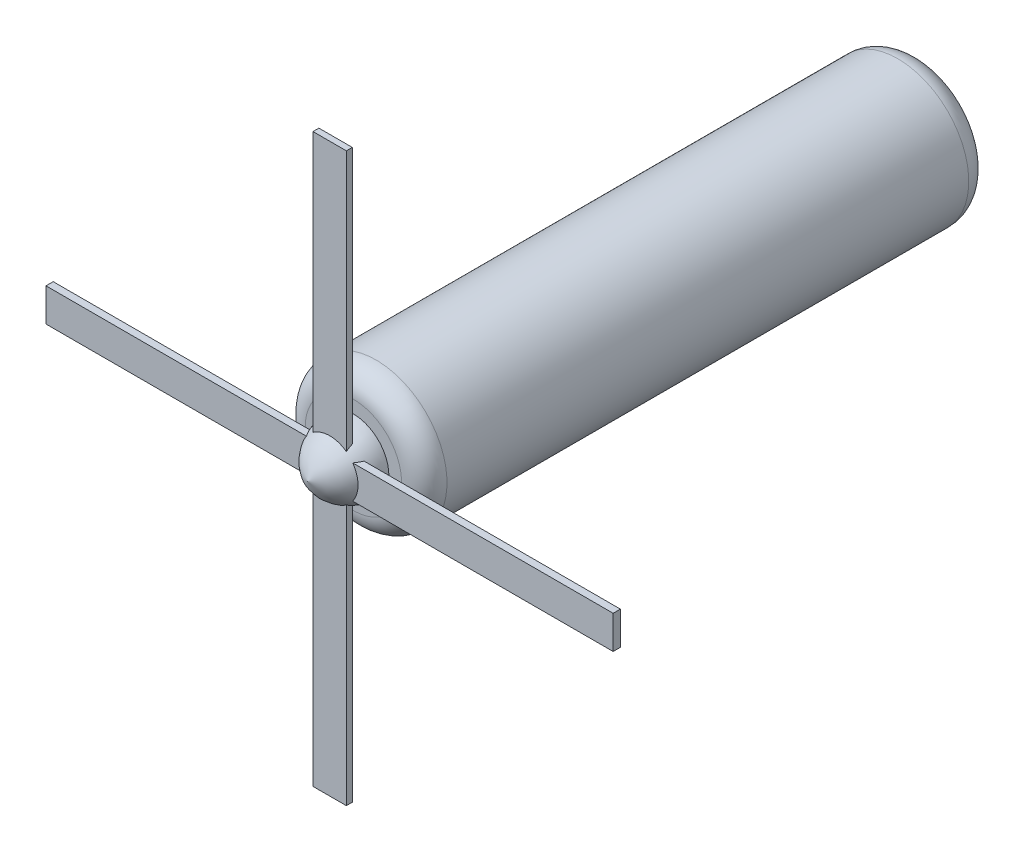
ISO-10303-21;
HEADER;
FILE_DESCRIPTION(('STEP AP214'),'2;1');
FILE_NAME('part.step','',(''),(''),'','','');
FILE_SCHEMA(('AUTOMOTIVE_DESIGN { 1 0 10303 214 1 1 1 1 }'));
ENDSEC;
DATA;
#1=APPLICATION_CONTEXT('core data for automotive mechanical design processes');
#2=APPLICATION_PROTOCOL_DEFINITION('international standard','automotive_design',2000,#1);
#3=PRODUCT_CONTEXT('',#1,'mechanical');
#4=PRODUCT('Part','Part','',(#3));
#5=PRODUCT_RELATED_PRODUCT_CATEGORY('part','',(#4));
#6=PRODUCT_DEFINITION_FORMATION('','',#4);
#7=PRODUCT_DEFINITION_CONTEXT('part definition',#1,'design');
#8=PRODUCT_DEFINITION('design','',#6,#7);
#9=PRODUCT_DEFINITION_SHAPE('','',#8);
#10=(LENGTH_UNIT() NAMED_UNIT(*) SI_UNIT(.MILLI.,.METRE.));
#11=(NAMED_UNIT(*) PLANE_ANGLE_UNIT() SI_UNIT($,.RADIAN.));
#12=(NAMED_UNIT(*) SI_UNIT($,.STERADIAN.) SOLID_ANGLE_UNIT());
#13=UNCERTAINTY_MEASURE_WITH_UNIT(LENGTH_MEASURE(1.E-05),#10,'distance_accuracy_value','');
#14=(GEOMETRIC_REPRESENTATION_CONTEXT(3) GLOBAL_UNCERTAINTY_ASSIGNED_CONTEXT((#13)) GLOBAL_UNIT_ASSIGNED_CONTEXT((#10,
#11,#12)) REPRESENTATION_CONTEXT('',''));
#15=CARTESIAN_POINT('',(0.,0.,0.));
#16=DIRECTION('',(0.,0.,1.));
#17=DIRECTION('',(1.,0.,0.));
#18=AXIS2_PLACEMENT_3D('',#15,#16,#17);
#19=CARTESIAN_POINT('',(0.,0.,0.));
#20=CARTESIAN_POINT('',(25.6502912204936,0.,-9.23171172538303));
#21=CARTESIAN_POINT('',(88.9920405419036,0.,-38.3100128710357));
#22=CARTESIAN_POINT('',(123.524419947238,0.,-115.240385969922));
#23=CARTESIAN_POINT('',(125.,0.,-161.246145611666));
#24=B_SPLINE_CURVE_WITH_KNOTS('',3,(#19,#20,#21,#22,#23),.UNSPECIFIED.,.F.,.F.,(4,1,4),(0.,
0.343948174187401,1.),.UNSPECIFIED.);
#25=CARTESIAN_POINT('',(0.,0.,0.));
#26=DIRECTION('',(0.,0.,1.));
#27=AXIS1_PLACEMENT('',#25,#26);
#28=SURFACE_OF_REVOLUTION('',#24,#27);
#29=CARTESIAN_POINT('',(0.,0.,-161.246145611666));
#30=DIRECTION('',(0.,0.,1.));
#31=DIRECTION('',(1.,0.,0.));
#32=AXIS2_PLACEMENT_3D('',#29,#30,#31);
#33=CIRCLE('',#32,125.);
#34=CARTESIAN_POINT('',(125.,0.,-161.246145611666));
#35=VERTEX_POINT('',#34);
#36=EDGE_CURVE('E222',#35,#35,#33,.T.);
#37=ORIENTED_EDGE('',*,*,#36,.T.);
#38=EDGE_LOOP('',(#37));
#39=FACE_BOUND('',#38,.T.);
#40=CARTESIAN_POINT('',(0.,0.,0.));
#41=VERTEX_POINT('',#40);
#42=VERTEX_LOOP('',#41);
#43=FACE_BOUND('',#42,.T.);
#44=CARTESIAN_POINT('',(0.,0.,-77.4921081017236));
#45=DIRECTION('',(0.,0.,1.));
#46=DIRECTION('',(1.,0.,0.));
#47=AXIS2_PLACEMENT_3D('',#44,#45,#46);
#48=CIRCLE('',#47,100.496676412725);
#49=CARTESIAN_POINT('',(58.8538375641332,81.4604675531548,-77.4921081017236));
#50=VERTEX_POINT('',#49);
#51=CARTESIAN_POINT('',(-58.8538375641332,81.4604675531549,-77.4921081017236));
#52=VERTEX_POINT('',#51);
#53=EDGE_CURVE('E378',#50,#52,#48,.T.);
#54=ORIENTED_EDGE('',*,*,#53,.T.);
#55=CARTESIAN_POINT('',(-58.8538375641332,81.4604675531549,-77.4921081017236));
#56=CARTESIAN_POINT('',(-58.8538375641332,81.8518368308111,-78.045705414009));
#57=CARTESIAN_POINT('',(-58.8538375641332,82.2394243898965,-78.6019745925555));
#58=CARTESIAN_POINT('',(-58.8538375641332,83.006708893746,-79.719222565566));
#59=CARTESIAN_POINT('',(-58.8538375641332,83.3864123579078,-80.2801968825479));
#60=CARTESIAN_POINT('',(-58.8538375641332,84.1380214047334,-81.4067939832809));
#61=CARTESIAN_POINT('',(-58.8538375641332,84.5099321099907,-81.972413349943));
#62=CARTESIAN_POINT('',(-58.8538375641332,85.2460388516834,-83.1082468306098));
#63=CARTESIAN_POINT('',(-58.8538375641332,85.6102386639113,-83.678458497797));
#64=CARTESIAN_POINT('',(-58.8538375641332,86.3309980730244,-84.8234282650685));
#65=CARTESIAN_POINT('',(-58.8538375641332,86.6875601410126,-85.3981848097219));
#66=CARTESIAN_POINT('',(-58.8538375641332,87.3931099440149,-86.5522017060144));
#67=CARTESIAN_POINT('',(-58.8538375641332,87.7420988803955,-87.1314613232096));
#68=CARTESIAN_POINT('',(-58.8538375641332,88.4325460620164,-88.294423624644));
#69=CARTESIAN_POINT('',(-58.8538375641332,88.7740045707935,-88.8781261524333));
#70=CARTESIAN_POINT('',(-58.8538375641332,89.4494583037353,-90.0499712692928));
#71=CARTESIAN_POINT('',(-58.8538375641332,89.7834521929333,-90.6381146277909));
#72=CARTESIAN_POINT('',(-58.8538375641332,90.444019902531,-91.8188179966803));
#73=CARTESIAN_POINT('',(-58.8538375641332,90.7705911407598,-92.4113794516308));
#74=CARTESIAN_POINT('',(-58.8538375641332,91.4163484340763,-93.6009001951204));
#75=CARTESIAN_POINT('',(-58.8538375641332,91.7355306758162,-94.1978615537164));
#76=CARTESIAN_POINT('',(-58.8538375641332,92.3665369278429,-95.3961675273323));
#77=CARTESIAN_POINT('',(-58.8538375641332,92.6783559032063,-95.9975147934797));
#78=CARTESIAN_POINT('',(-58.8538375641332,93.2946538001525,-97.2045831960131));
#79=CARTESIAN_POINT('',(-58.8538375641332,93.5991264676442,-97.810307525656));
#80=CARTESIAN_POINT('',(-58.8538375641332,93.8997882581418,-98.4179170134139));
#81=B_SPLINE_CURVE_WITH_KNOTS('',3,(#55,#56,#57,#58,#59,#60,#61,#62,#63,#64,#65,#66,#67,#68,#69,
#70,#71,#72,#73,#74,#75,#76,#77,#78,#79,#80),.UNSPECIFIED.,.F.,.F.,(4,2,2,2,2,2,2,2,2,2,2,2,4),
(0.,2.03388463358387,4.06601445824408,6.0967636600217,8.12649432418452,10.1555580589514,
12.1842975239531,14.2129658776479,16.241994179699,18.2717178530452,20.3024666805953,
22.3345660994062,24.3683384594325),.UNSPECIFIED.);
#82=CARTESIAN_POINT('',(-58.8538375641332,93.8997882581418,-98.4179170134139));
#83=VERTEX_POINT('',#82);
#84=EDGE_CURVE('E252',#52,#83,#81,.T.);
#85=ORIENTED_EDGE('',*,*,#84,.T.);
#86=CARTESIAN_POINT('',(0.,0.,-98.4179170134139));
#87=DIRECTION('',(0.,0.,1.));
#88=DIRECTION('',(1.,0.,0.));
#89=AXIS2_PLACEMENT_3D('',#86,#87,#88);
#90=CIRCLE('',#89,110.819422625049);
#91=CARTESIAN_POINT('',(58.8538375641332,93.8997882581418,-98.4179170134139));
#92=VERTEX_POINT('',#91);
#93=EDGE_CURVE('E372',#83,#92,#90,.F.);
#94=ORIENTED_EDGE('',*,*,#93,.T.);
#95=CARTESIAN_POINT('',(58.8538375641332,93.8997882581418,-98.417917013414));
#96=CARTESIAN_POINT('',(58.8538375641332,93.5991264676443,-97.810307525656));
#97=CARTESIAN_POINT('',(58.8538375641332,93.2946538001525,-97.2045831960131));
#98=CARTESIAN_POINT('',(58.8538375641332,92.6783559032063,-95.9975147934797));
#99=CARTESIAN_POINT('',(58.8538375641332,92.3665369278429,-95.3961675273323));
#100=CARTESIAN_POINT('',(58.8538375641332,91.7355306758162,-94.1978615537165));
#101=CARTESIAN_POINT('',(58.8538375641332,91.4163484340763,-93.6009001951204));
#102=CARTESIAN_POINT('',(58.8538375641332,90.7705911407598,-92.4113794516308));
#103=CARTESIAN_POINT('',(58.8538375641332,90.444019902531,-91.8188179966803));
#104=CARTESIAN_POINT('',(58.8538375641332,89.7834521929333,-90.6381146277909));
#105=CARTESIAN_POINT('',(58.8538375641332,89.4494583037353,-90.0499712692928));
#106=CARTESIAN_POINT('',(58.8538375641332,88.7740045707935,-88.8781261524333));
#107=CARTESIAN_POINT('',(58.8538375641332,88.4325460620164,-88.294423624644));
#108=CARTESIAN_POINT('',(58.8538375641332,87.7420988803955,-87.1314613232096));
#109=CARTESIAN_POINT('',(58.8538375641332,87.3931099440149,-86.5522017060144));
#110=CARTESIAN_POINT('',(58.8538375641332,86.6875601410126,-85.3981848097219));
#111=CARTESIAN_POINT('',(58.8538375641332,86.3309980730244,-84.8234282650685));
#112=CARTESIAN_POINT('',(58.8538375641332,85.6102386639113,-83.678458497797));
#113=CARTESIAN_POINT('',(58.8538375641332,85.2460388516834,-83.1082468306098));
#114=CARTESIAN_POINT('',(58.8538375641332,84.5099321099907,-81.972413349943));
#115=CARTESIAN_POINT('',(58.8538375641332,84.1380214047334,-81.4067939832809));
#116=CARTESIAN_POINT('',(58.8538375641332,83.3864123579078,-80.2801968825479));
#117=CARTESIAN_POINT('',(58.8538375641332,83.006708893746,-79.719222565566));
#118=CARTESIAN_POINT('',(58.8538375641332,82.2394243898964,-78.6019745925554));
#119=CARTESIAN_POINT('',(58.8538375641332,81.8518368308111,-78.0457054140089));
#120=CARTESIAN_POINT('',(58.8538375641332,81.4604675531549,-77.4921081017235));
#121=B_SPLINE_CURVE_WITH_KNOTS('',3,(#95,#96,#97,#98,#99,#100,#101,#102,#103,#104,#105,#106,
#107,#108,#109,#110,#111,#112,#113,#114,#115,#116,#117,#118,#119,#120),.UNSPECIFIED.,.F.,.F.,(4,
2,2,2,2,2,2,2,2,2,2,2,4),(0.,2.0337723600263,4.06587177883716,6.09662060638733,8.12634427973348,
10.1553725817846,12.1840409354794,14.2127804004811,16.241844135248,18.2715747994108,
20.3023240011884,22.3344538258487,24.3683384594326),.UNSPECIFIED.);
#122=EDGE_CURVE('E241',#92,#50,#121,.T.);
#123=ORIENTED_EDGE('',*,*,#122,.T.);
#124=EDGE_LOOP('',(#54,#85,#94,#123));
#125=FACE_BOUND('',#124,.T.);
#126=CARTESIAN_POINT('',(58.8538375641332,-93.8997882581418,-98.4179170134139));
#127=VERTEX_POINT('',#126);
#128=CARTESIAN_POINT('',(-58.8538375641332,-93.8997882581418,-98.4179170134139));
#129=VERTEX_POINT('',#128);
#130=EDGE_CURVE('E374',#127,#129,#90,.F.);
#131=ORIENTED_EDGE('',*,*,#130,.T.);
#132=CARTESIAN_POINT('',(-58.8538375641332,-93.8997882581418,-98.417917013414));
#133=CARTESIAN_POINT('',(-58.8538375641332,-93.5991264676443,-97.810307525656));
#134=CARTESIAN_POINT('',(-58.8538375641332,-93.2946538001525,-97.2045831960131));
#135=CARTESIAN_POINT('',(-58.8538375641332,-92.6783559032063,-95.9975147934797));
#136=CARTESIAN_POINT('',(-58.8538375641332,-92.3665369278429,-95.3961675273323));
#137=CARTESIAN_POINT('',(-58.8538375641332,-91.7355306758162,-94.1978615537165));
#138=CARTESIAN_POINT('',(-58.8538375641332,-91.4163484340763,-93.6009001951204));
#139=CARTESIAN_POINT('',(-58.8538375641332,-90.7705911407598,-92.4113794516309));
#140=CARTESIAN_POINT('',(-58.8538375641332,-90.444019902531,-91.8188179966804));
#141=CARTESIAN_POINT('',(-58.8538375641332,-89.7834521929333,-90.6381146277909));
#142=CARTESIAN_POINT('',(-58.8538375641332,-89.4494583037353,-90.0499712692928));
#143=CARTESIAN_POINT('',(-58.8538375641332,-88.7740045707935,-88.8781261524333));
#144=CARTESIAN_POINT('',(-58.8538375641332,-88.4325460620164,-88.294423624644));
#145=CARTESIAN_POINT('',(-58.8538375641332,-87.7420988803955,-87.1314613232096));
#146=CARTESIAN_POINT('',(-58.8538375641332,-87.3931099440149,-86.5522017060144));
#147=CARTESIAN_POINT('',(-58.8538375641332,-86.6875601410126,-85.3981848097219));
#148=CARTESIAN_POINT('',(-58.8538375641332,-86.3309980730244,-84.8234282650685));
#149=CARTESIAN_POINT('',(-58.8538375641332,-85.6102386639113,-83.678458497797));
#150=CARTESIAN_POINT('',(-58.8538375641332,-85.2460388516834,-83.1082468306098));
#151=CARTESIAN_POINT('',(-58.8538375641332,-84.5099321099907,-81.972413349943));
#152=CARTESIAN_POINT('',(-58.8538375641332,-84.1380214047334,-81.4067939832809));
#153=CARTESIAN_POINT('',(-58.8538375641332,-83.3864123579078,-80.2801968825479));
#154=CARTESIAN_POINT('',(-58.8538375641332,-83.006708893746,-79.719222565566));
#155=CARTESIAN_POINT('',(-58.8538375641332,-82.2394243898965,-78.6019745925555));
#156=CARTESIAN_POINT('',(-58.8538375641332,-81.8518368308111,-78.045705414009));
#157=CARTESIAN_POINT('',(-58.8538375641332,-81.4604675531549,-77.4921081017236));
#158=B_SPLINE_CURVE_WITH_KNOTS('',3,(#132,#133,#134,#135,#136,#137,#138,#139,#140,#141,#142,
#143,#144,#145,#146,#147,#148,#149,#150,#151,#152,#153,#154,#155,#156,#157),.UNSPECIFIED.,.F.,
.F.,(4,2,2,2,2,2,2,2,2,2,2,2,4),(0.,2.03377236002629,4.06587177883713,6.0966206063873,
8.12634427973344,10.1553725817846,12.1840409354793,14.2127804004811,16.241844135248,
18.2715747994108,20.3023240011884,22.3344538258486,24.3683384594325),.UNSPECIFIED.);
#159=CARTESIAN_POINT('',(-58.8538375641332,-81.4604675531549,-77.4921081017236));
#160=VERTEX_POINT('',#159);
#161=EDGE_CURVE('E267',#129,#160,#158,.T.);
#162=ORIENTED_EDGE('',*,*,#161,.T.);
#163=CARTESIAN_POINT('',(58.8538375641332,-81.4604675531549,-77.4921081017236));
#164=VERTEX_POINT('',#163);
#165=EDGE_CURVE('E383',#160,#164,#48,.T.);
#166=ORIENTED_EDGE('',*,*,#165,.T.);
#167=CARTESIAN_POINT('',(58.8538375641332,-81.4604675531549,-77.4921081017236));
#168=CARTESIAN_POINT('',(58.8538375641332,-81.8518368308111,-78.045705414009));
#169=CARTESIAN_POINT('',(58.8538375641332,-82.2394243898965,-78.6019745925555));
#170=CARTESIAN_POINT('',(58.8538375641332,-83.006708893746,-79.719222565566));
#171=CARTESIAN_POINT('',(58.8538375641332,-83.3864123579078,-80.2801968825479));
#172=CARTESIAN_POINT('',(58.8538375641332,-84.1380214047334,-81.4067939832809));
#173=CARTESIAN_POINT('',(58.8538375641332,-84.5099321099908,-81.972413349943));
#174=CARTESIAN_POINT('',(58.8538375641332,-85.2460388516834,-83.1082468306098));
#175=CARTESIAN_POINT('',(58.8538375641332,-85.6102386639113,-83.6784584977971));
#176=CARTESIAN_POINT('',(58.8538375641332,-86.3309980730244,-84.8234282650686));
#177=CARTESIAN_POINT('',(58.8538375641332,-86.6875601410126,-85.3981848097219));
#178=CARTESIAN_POINT('',(58.8538375641332,-87.3931099440149,-86.5522017060145));
#179=CARTESIAN_POINT('',(58.8538375641332,-87.7420988803955,-87.1314613232096));
#180=CARTESIAN_POINT('',(58.8538375641332,-88.4325460620165,-88.294423624644));
#181=CARTESIAN_POINT('',(58.8538375641332,-88.7740045707936,-88.8781261524334));
#182=CARTESIAN_POINT('',(58.8538375641332,-89.4494583037353,-90.0499712692929));
#183=CARTESIAN_POINT('',(58.8538375641332,-89.7834521929334,-90.638114627791));
#184=CARTESIAN_POINT('',(58.8538375641332,-90.444019902531,-91.8188179966804));
#185=CARTESIAN_POINT('',(58.8538375641332,-90.7705911407599,-92.4113794516309));
#186=CARTESIAN_POINT('',(58.8538375641332,-91.4163484340764,-93.6009001951204));
#187=CARTESIAN_POINT('',(58.8538375641332,-91.7355306758163,-94.1978615537165));
#188=CARTESIAN_POINT('',(58.8538375641332,-92.366536927843,-95.3961675273324));
#189=CARTESIAN_POINT('',(58.8538375641332,-92.6783559032064,-95.9975147934797));
#190=CARTESIAN_POINT('',(58.8538375641332,-93.2946538001525,-97.2045831960131));
#191=CARTESIAN_POINT('',(58.8538375641332,-93.5991264676443,-97.8103075256561));
#192=CARTESIAN_POINT('',(58.8538375641332,-93.8997882581418,-98.417917013414));
#193=B_SPLINE_CURVE_WITH_KNOTS('',3,(#167,#168,#169,#170,#171,#172,#173,#174,#175,#176,#177,
#178,#179,#180,#181,#182,#183,#184,#185,#186,#187,#188,#189,#190,#191,#192),.UNSPECIFIED.,.F.,
.F.,(4,2,2,2,2,2,2,2,2,2,2,2,4),(0.,2.03388463358387,4.0660144582441,6.09676366002171,
8.12649432418456,10.1555580589514,12.1842975239532,14.2129658776479,16.2419941796991,
18.2717178530452,20.3024666805954,22.3345660994062,24.3683384594325),.UNSPECIFIED.);
#194=EDGE_CURVE('E260',#164,#127,#193,.T.);
#195=ORIENTED_EDGE('',*,*,#194,.T.);
#196=EDGE_LOOP('',(#131,#162,#166,#195));
#197=FACE_BOUND('',#196,.T.);
#198=CARTESIAN_POINT('',(96.1919204966239,-58.4029933950139,-102.646254802604));
#199=CARTESIAN_POINT('',(95.6295350419684,-58.4029933950139,-101.418791584328));
#200=CARTESIAN_POINT('',(95.0519791758546,-58.4029933950139,-100.198271696093));
#201=CARTESIAN_POINT('',(93.8665471616132,-58.4029933950139,-97.771724455795));
#202=CARTESIAN_POINT('',(93.2586645659672,-58.4029933950139,-96.5657002537549));
#203=CARTESIAN_POINT('',(92.0127827145154,-58.4029933950139,-94.1691651395839));
#204=CARTESIAN_POINT('',(91.3747806983561,-58.4029933950139,-92.9786556621387));
#205=CARTESIAN_POINT('',(90.0711864321156,-58.4029933950139,-90.6185021166963));
#206=CARTESIAN_POINT('',(89.405703362363,-58.4029933950139,-89.4487977595059));
#207=CARTESIAN_POINT('',(88.0451008283854,-58.4029933950139,-87.1268921118549));
#208=CARTESIAN_POINT('',(87.3499839829918,-58.4029933950139,-85.9746892868835));
#209=CARTESIAN_POINT('',(85.930171984353,-58.4029933950139,-83.6888580667311));
#210=CARTESIAN_POINT('',(85.2054809999727,-58.4029933950139,-82.555227084961));
#211=CARTESIAN_POINT('',(83.9918265876694,-58.4029933950139,-80.7108111679923));
#212=CARTESIAN_POINT('',(83.5115922018645,-58.4029933950139,-79.9942679965446));
#213=CARTESIAN_POINT('',(82.5385404610264,-58.4029933950139,-78.5689586874799));
#214=CARTESIAN_POINT('',(82.0457135916182,-58.4029933950139,-77.8601990457563));
#215=CARTESIAN_POINT('',(81.5467662452357,-58.4029933950139,-77.1557590921573));
#216=B_SPLINE_CURVE_WITH_KNOTS('',3,(#198,#199,#200,#201,#202,#203,#204,#205,#206,#207,#208,
#209,#210,#211,#212,#213,#214,#215),.UNSPECIFIED.,.F.,.F.,(4,2,2,2,2,2,2,2,4),(0.,
4.05039931942367,8.10166346166979,12.1532996135142,16.1901502845962,20.2266449428329,
24.2625725561671,26.8502215968284,29.4398872180629),.UNSPECIFIED.);
#217=CARTESIAN_POINT('',(96.1919204966238,-58.4029933950139,-102.646254802604));
#218=VERTEX_POINT('',#217);
#219=CARTESIAN_POINT('',(81.5467662452357,-58.4029933950139,-77.1557590921573));
#220=VERTEX_POINT('',#219);
#221=EDGE_CURVE('E282',#218,#220,#216,.T.);
#222=ORIENTED_EDGE('',*,*,#221,.T.);
#223=CARTESIAN_POINT('',(0.,0.,-77.1557590921573));
#224=DIRECTION('',(0.,0.,1.));
#225=DIRECTION('',(1.,0.,0.));
#226=AXIS2_PLACEMENT_3D('',#223,#224,#225);
#227=CIRCLE('',#226,100.303463163308);
#228=CARTESIAN_POINT('',(81.5467662452357,58.4029933950139,-77.1557590921573));
#229=VERTEX_POINT('',#228);
#230=EDGE_CURVE('E49',#220,#229,#227,.T.);
#231=ORIENTED_EDGE('',*,*,#230,.T.);
#232=CARTESIAN_POINT('',(81.5467662452357,58.4029933950139,-77.1557590921573));
#233=CARTESIAN_POINT('',(82.2941359791022,58.4029933950139,-78.2109462434219));
#234=CARTESIAN_POINT('',(83.0277880570042,58.4029933950139,-79.2758291969087));
#235=CARTESIAN_POINT('',(84.4676918163973,58.4029933950139,-81.424001516216));
#236=CARTESIAN_POINT('',(85.1739428431596,58.4029933950139,-82.5072913209672));
#237=CARTESIAN_POINT('',(86.5590656968879,58.4029933950139,-84.6912763053782));
#238=CARTESIAN_POINT('',(87.2379366544571,58.4029933950139,-85.7919720361845));
#239=CARTESIAN_POINT('',(88.5660424029849,58.4029933950139,-88.0060972987876));
#240=CARTESIAN_POINT('',(89.2153686543135,58.4029933950139,-89.119471981722));
#241=CARTESIAN_POINT('',(90.4867334219318,58.4029933950139,-91.3616395238967));
#242=CARTESIAN_POINT('',(91.1087728490818,58.4029933950139,-92.4904318668288));
#243=CARTESIAN_POINT('',(92.3254622600175,58.4029933950139,-94.7625399941993));
#244=CARTESIAN_POINT('',(92.9201149822889,58.4029933950139,-95.9058543118887));
#245=CARTESIAN_POINT('',(93.9670307226149,58.4029933950139,-97.9787053717876));
#246=CARTESIAN_POINT('',(94.4241851807839,58.4029933950139,-98.9057759354708));
#247=CARTESIAN_POINT('',(95.3211798048874,58.4029933950139,-100.769282135297));
#248=CARTESIAN_POINT('',(95.7610040479469,58.4029933950139,-101.705725436224));
#249=CARTESIAN_POINT('',(96.1919204966238,58.4029933950139,-102.646254802604));
#250=B_SPLINE_CURVE_WITH_KNOTS('',3,(#232,#233,#234,#235,#236,#237,#238,#239,#240,#241,#242,
#243,#244,#245,#246,#247,#248,#249),.UNSPECIFIED.,.F.,.F.,(4,2,2,2,2,2,2,2,4),(0.,
3.87902045212345,7.75813353372586,11.6373696916473,15.503641660822,19.3697844717884,
23.2355398514702,26.3363346255269,29.4399149373714),.UNSPECIFIED.);
#251=CARTESIAN_POINT('',(96.1919204966238,58.4029933950139,-102.646254802604));
#252=VERTEX_POINT('',#251);
#253=EDGE_CURVE('E274',#229,#252,#250,.T.);
#254=ORIENTED_EDGE('',*,*,#253,.T.);
#255=CARTESIAN_POINT('',(0.,0.,-102.646254802604));
#256=DIRECTION('',(0.,0.,1.));
#257=DIRECTION('',(1.,0.,0.));
#258=AXIS2_PLACEMENT_3D('',#255,#256,#257);
#259=CIRCLE('',#258,112.533529253849);
#260=EDGE_CURVE('E388',#252,#218,#259,.F.);
#261=ORIENTED_EDGE('',*,*,#260,.T.);
#262=EDGE_LOOP('',(#222,#231,#254,#261));
#263=FACE_BOUND('',#262,.T.);
#264=CARTESIAN_POINT('',(-96.1919204966239,58.4029933950139,-102.646254802604));
#265=CARTESIAN_POINT('',(-95.6295350419684,58.4029933950139,-101.418791584328));
#266=CARTESIAN_POINT('',(-95.0519791758546,58.4029933950139,-100.198271696093));
#267=CARTESIAN_POINT('',(-93.8665471616132,58.4029933950139,-97.771724455795));
#268=CARTESIAN_POINT('',(-93.2586645659672,58.4029933950139,-96.5657002537549));
#269=CARTESIAN_POINT('',(-92.0127827145154,58.4029933950139,-94.169165139584));
#270=CARTESIAN_POINT('',(-91.3747806983561,58.4029933950139,-92.9786556621388));
#271=CARTESIAN_POINT('',(-90.0711864321156,58.4029933950139,-90.6185021166963));
#272=CARTESIAN_POINT('',(-89.405703362363,58.4029933950139,-89.4487977595059));
#273=CARTESIAN_POINT('',(-88.0451008283854,58.4029933950139,-87.126892111855));
#274=CARTESIAN_POINT('',(-87.3499839829917,58.4029933950139,-85.9746892868835));
#275=CARTESIAN_POINT('',(-85.9301719843531,58.4029933950139,-83.6888580667311));
#276=CARTESIAN_POINT('',(-85.2054809999728,58.4029933950139,-82.5552270849609));
#277=CARTESIAN_POINT('',(-83.9918265876695,58.4029933950139,-80.7108111679923));
#278=CARTESIAN_POINT('',(-83.5115922018646,58.4029933950139,-79.9942679965447));
#279=CARTESIAN_POINT('',(-82.5385404610264,58.4029933950139,-78.56895868748));
#280=CARTESIAN_POINT('',(-82.0457135916183,58.4029933950139,-77.8601990457564));
#281=CARTESIAN_POINT('',(-81.5467662452358,58.4029933950139,-77.1557590921574));
#282=B_SPLINE_CURVE_WITH_KNOTS('',3,(#264,#265,#266,#267,#268,#269,#270,#271,#272,#273,#274,
#275,#276,#277,#278,#279,#280,#281),.UNSPECIFIED.,.F.,.F.,(4,2,2,2,2,2,2,2,4),(0.,
4.05039931942367,8.10166346166977,12.1532996135141,16.1901502845963,20.2266449428329,
24.2625725561671,26.8502215968283,29.4398872180628),.UNSPECIFIED.);
#283=CARTESIAN_POINT('',(-96.191920496624,58.4029933950139,-102.646254802604));
#284=VERTEX_POINT('',#283);
#285=CARTESIAN_POINT('',(-81.5467662452358,58.4029933950138,-77.1557590921574));
#286=VERTEX_POINT('',#285);
#287=EDGE_CURVE('E287',#284,#286,#282,.T.);
#288=ORIENTED_EDGE('',*,*,#287,.T.);
#289=CARTESIAN_POINT('',(-81.5467662452358,-58.4029933950139,-77.1557590921573));
#290=VERTEX_POINT('',#289);
#291=EDGE_CURVE('E11',#286,#290,#227,.T.);
#292=ORIENTED_EDGE('',*,*,#291,.T.);
#293=CARTESIAN_POINT('',(-81.5467662452358,-58.4029933950138,-77.1557590921573));
#294=CARTESIAN_POINT('',(-82.2941359791023,-58.4029933950139,-78.2109462434219));
#295=CARTESIAN_POINT('',(-83.0277880570042,-58.4029933950139,-79.2758291969087));
#296=CARTESIAN_POINT('',(-84.4676918163974,-58.4029933950139,-81.4240015162161));
#297=CARTESIAN_POINT('',(-85.1739428431596,-58.4029933950139,-82.5072913209672));
#298=CARTESIAN_POINT('',(-86.5590656968879,-58.4029933950139,-84.6912763053782));
#299=CARTESIAN_POINT('',(-87.2379366544571,-58.4029933950139,-85.7919720361845));
#300=CARTESIAN_POINT('',(-88.5660424029849,-58.4029933950139,-88.0060972987876));
#301=CARTESIAN_POINT('',(-89.2153686543135,-58.4029933950139,-89.119471981722));
#302=CARTESIAN_POINT('',(-90.4867334219318,-58.4029933950139,-91.3616395238968));
#303=CARTESIAN_POINT('',(-91.1087728490818,-58.4029933950139,-92.4904318668288));
#304=CARTESIAN_POINT('',(-92.3254622600175,-58.4029933950139,-94.7625399941993));
#305=CARTESIAN_POINT('',(-92.9201149822888,-58.4029933950139,-95.9058543118888));
#306=CARTESIAN_POINT('',(-93.9670307226149,-58.4029933950139,-97.9787053717877));
#307=CARTESIAN_POINT('',(-94.424185180784,-58.4029933950139,-98.9057759354708));
#308=CARTESIAN_POINT('',(-95.3211798048875,-58.4029933950139,-100.769282135297));
#309=CARTESIAN_POINT('',(-95.7610040479469,-58.4029933950139,-101.705725436224));
#310=CARTESIAN_POINT('',(-96.1919204966239,-58.4029933950139,-102.646254802605));
#311=B_SPLINE_CURVE_WITH_KNOTS('',3,(#293,#294,#295,#296,#297,#298,#299,#300,#301,#302,#303,
#304,#305,#306,#307,#308,#309,#310),.UNSPECIFIED.,.F.,.F.,(4,2,2,2,2,2,2,2,4),(0.,
3.87902045212344,7.75813353372581,11.6373696916473,15.503641660822,19.3697844717884,
23.2355398514702,26.3363346255269,29.4399149373714),.UNSPECIFIED.);
#312=CARTESIAN_POINT('',(-96.1919204966238,-58.4029933950139,-102.646254802604));
#313=VERTEX_POINT('',#312);
#314=EDGE_CURVE('E37',#290,#313,#311,.T.);
#315=ORIENTED_EDGE('',*,*,#314,.T.);
#316=EDGE_CURVE('E293',#313,#284,#259,.F.);
#317=ORIENTED_EDGE('',*,*,#316,.T.);
#318=EDGE_LOOP('',(#288,#292,#315,#317));
#319=FACE_BOUND('',#318,.T.);
#320=ADVANCED_FACE('F33',(#39,#43,#125,#197,#263,#319),#28,.F.);
#321=CARTESIAN_POINT('',(0.,0.,-2161.24614561167));
#322=DIRECTION('',(0.,0.,1.));
#323=DIRECTION('',(1.,0.,0.));
#324=AXIS2_PLACEMENT_3D('',#321,#322,#323);
#325=CYLINDRICAL_SURFACE('',#324,250.);
#326=CARTESIAN_POINT('',(0.,0.,-241.246145611666));
#327=DIRECTION('',(0.,0.,-1.));
#328=DIRECTION('',(-1.,0.,0.));
#329=AXIS2_PLACEMENT_3D('',#326,#327,#328);
#330=CIRCLE('',#329,250.);
#331=CARTESIAN_POINT('',(-250.,0.,-241.246145611666));
#332=VERTEX_POINT('',#331);
#333=EDGE_CURVE('E363',#332,#332,#330,.T.);
#334=ORIENTED_EDGE('',*,*,#333,.T.);
#335=EDGE_LOOP('',(#334));
#336=FACE_BOUND('',#335,.T.);
#337=CARTESIAN_POINT('',(0.,0.,-2081.24614561167));
#338=DIRECTION('',(0.,0.,-1.));
#339=DIRECTION('',(-1.,0.,0.));
#340=AXIS2_PLACEMENT_3D('',#337,#338,#339);
#341=CIRCLE('',#340,250.);
#342=CARTESIAN_POINT('',(-250.,0.,-2081.24614561167));
#343=VERTEX_POINT('',#342);
#344=EDGE_CURVE('E361',#343,#343,#341,.F.);
#345=ORIENTED_EDGE('',*,*,#344,.T.);
#346=EDGE_LOOP('',(#345));
#347=FACE_BOUND('',#346,.T.);
#348=ADVANCED_FACE('F234',(#336,#347),#325,.T.);
#349=CARTESIAN_POINT('',(0.,0.,-2161.24614561167));
#350=DIRECTION('',(0.,0.,-1.));
#351=DIRECTION('',(-1.,0.,0.));
#352=AXIS2_PLACEMENT_3D('',#349,#350,#351);
#353=PLANE('',#352);
#354=CARTESIAN_POINT('',(0.,0.,-2161.24614561167));
#355=DIRECTION('',(0.,0.,-1.));
#356=DIRECTION('',(-1.,0.,0.));
#357=AXIS2_PLACEMENT_3D('',#354,#355,#356);
#358=CIRCLE('',#357,170.);
#359=CARTESIAN_POINT('',(-170.,0.,-2161.24614561167));
#360=VERTEX_POINT('',#359);
#361=EDGE_CURVE('E370',#360,#360,#358,.T.);
#362=ORIENTED_EDGE('',*,*,#361,.T.);
#363=EDGE_LOOP('',(#362));
#364=FACE_BOUND('',#363,.T.);
#365=ADVANCED_FACE('F344',(#364),#353,.T.);
#366=CARTESIAN_POINT('',(0.,0.,-161.246145611666));
#367=DIRECTION('',(0.,0.,-1.));
#368=DIRECTION('',(-1.,0.,0.));
#369=AXIS2_PLACEMENT_3D('',#366,#367,#368);
#370=PLANE('',#369);
#371=CARTESIAN_POINT('',(0.,0.,-161.246145611666));
#372=DIRECTION('',(0.,0.,-1.));
#373=DIRECTION('',(-1.,0.,0.));
#374=AXIS2_PLACEMENT_3D('',#371,#372,#373);
#375=CIRCLE('',#374,170.);
#376=CARTESIAN_POINT('',(-170.,0.,-161.246145611666));
#377=VERTEX_POINT('',#376);
#378=EDGE_CURVE('E358',#377,#377,#375,.F.);
#379=ORIENTED_EDGE('',*,*,#378,.T.);
#380=EDGE_LOOP('',(#379));
#381=FACE_BOUND('',#380,.T.);
#382=ORIENTED_EDGE('',*,*,#36,.F.);
#383=EDGE_LOOP('',(#382));
#384=FACE_BOUND('',#383,.T.);
#385=ADVANCED_FACE('F347',(#381,#384),#370,.F.);
#386=CARTESIAN_POINT('',(0.,0.,-241.246145611666));
#387=DIRECTION('',(0.,0.,-1.));
#388=DIRECTION('',(-1.,0.,0.));
#389=AXIS2_PLACEMENT_3D('',#386,#387,#388);
#390=TOROIDAL_SURFACE('',#389,170.,80.);
#391=ORIENTED_EDGE('',*,*,#378,.F.);
#392=EDGE_LOOP('',(#391));
#393=FACE_BOUND('',#392,.T.);
#394=ORIENTED_EDGE('',*,*,#333,.F.);
#395=EDGE_LOOP('',(#394));
#396=FACE_BOUND('',#395,.T.);
#397=ADVANCED_FACE('F237',(#393,#396),#390,.T.);
#398=CARTESIAN_POINT('',(0.,0.,-2081.24614561167));
#399=DIRECTION('',(0.,0.,-1.));
#400=DIRECTION('',(-1.,0.,0.));
#401=AXIS2_PLACEMENT_3D('',#398,#399,#400);
#402=TOROIDAL_SURFACE('',#401,170.,80.);
#403=ORIENTED_EDGE('',*,*,#344,.F.);
#404=EDGE_LOOP('',(#403));
#405=FACE_BOUND('',#404,.T.);
#406=ORIENTED_EDGE('',*,*,#361,.F.);
#407=EDGE_LOOP('',(#406));
#408=FACE_BOUND('',#407,.T.);
#409=ADVANCED_FACE('F35',(#405,#408),#402,.T.);
#410=CARTESIAN_POINT('',(0.,1000.,0.));
#411=DIRECTION('',(0.,1.,0.));
#412=DIRECTION('',(0.,0.,1.));
#413=AXIS2_PLACEMENT_3D('',#410,#411,#412);
#414=PLANE('',#413);
#415=DIRECTION('',(0.,0.,1.));
#416=VECTOR('',#415,1.);
#417=CARTESIAN_POINT('',(-58.8538375641332,1000.,-77.4921081017236));
#418=LINE('',#417,#416);
#419=CARTESIAN_POINT('',(-58.8538375641332,1000.,-98.417917013414));
#420=VERTEX_POINT('',#419);
#421=CARTESIAN_POINT('',(-58.8538375641332,1000.,-77.4921081017236));
#422=VERTEX_POINT('',#421);
#423=EDGE_CURVE('E190',#420,#422,#418,.T.);
#424=ORIENTED_EDGE('',*,*,#423,.T.);
#425=DIRECTION('',(1.,0.,0.));
#426=VECTOR('',#425,1.);
#427=CARTESIAN_POINT('',(58.8538375641332,1000.,-77.4921081017236));
#428=LINE('',#427,#426);
#429=CARTESIAN_POINT('',(58.8538375641332,1000.,-77.4921081017236));
#430=VERTEX_POINT('',#429);
#431=EDGE_CURVE('E193',#422,#430,#428,.T.);
#432=ORIENTED_EDGE('',*,*,#431,.T.);
#433=DIRECTION('',(0.,0.,-1.));
#434=VECTOR('',#433,1.);
#435=CARTESIAN_POINT('',(58.8538375641332,1000.,-77.4921081017236));
#436=LINE('',#435,#434);
#437=CARTESIAN_POINT('',(58.8538375641332,1000.,-98.417917013414));
#438=VERTEX_POINT('',#437);
#439=EDGE_CURVE('E196',#430,#438,#436,.T.);
#440=ORIENTED_EDGE('',*,*,#439,.T.);
#441=DIRECTION('',(-1.,0.,0.));
#442=VECTOR('',#441,1.);
#443=CARTESIAN_POINT('',(58.8538375641332,1000.,-98.417917013414));
#444=LINE('',#443,#442);
#445=EDGE_CURVE('E198',#438,#420,#444,.T.);
#446=ORIENTED_EDGE('',*,*,#445,.T.);
#447=EDGE_LOOP('',(#424,#432,#440,#446));
#448=FACE_BOUND('',#447,.T.);
#449=ADVANCED_FACE('F315',(#448),#414,.T.);
#450=CARTESIAN_POINT('',(58.8538375641332,1000.,-98.417917013414));
#451=DIRECTION('',(0.,0.,1.));
#452=DIRECTION('',(1.,0.,0.));
#453=AXIS2_PLACEMENT_3D('',#450,#451,#452);
#454=PLANE('',#453);
#455=ORIENTED_EDGE('',*,*,#93,.F.);
#456=DIRECTION('',(0.,-1.,0.));
#457=VECTOR('',#456,1.);
#458=CARTESIAN_POINT('',(-58.8538375641332,1000.,-98.417917013414));
#459=LINE('',#458,#457);
#460=EDGE_CURVE('E208',#420,#83,#459,.T.);
#461=ORIENTED_EDGE('',*,*,#460,.F.);
#462=ORIENTED_EDGE('',*,*,#445,.F.);
#463=DIRECTION('',(0.,-1.,0.));
#464=VECTOR('',#463,1.);
#465=CARTESIAN_POINT('',(58.8538375641332,1000.,-98.417917013414));
#466=LINE('',#465,#464);
#467=EDGE_CURVE('E212',#438,#92,#466,.T.);
#468=ORIENTED_EDGE('',*,*,#467,.T.);
#469=EDGE_LOOP('',(#455,#461,#462,#468));
#470=FACE_BOUND('',#469,.T.);
#471=ADVANCED_FACE('F318',(#470),#454,.F.);
#472=CARTESIAN_POINT('',(58.8538375641332,1000.,-77.4921081017236));
#473=DIRECTION('',(-1.,0.,0.));
#474=DIRECTION('',(0.,0.,1.));
#475=AXIS2_PLACEMENT_3D('',#472,#473,#474);
#476=PLANE('',#475);
#477=ORIENTED_EDGE('',*,*,#122,.F.);
#478=ORIENTED_EDGE('',*,*,#467,.F.);
#479=ORIENTED_EDGE('',*,*,#439,.F.);
#480=DIRECTION('',(0.,-1.,0.));
#481=VECTOR('',#480,1.);
#482=CARTESIAN_POINT('',(58.8538375641332,1000.,-77.4921081017236));
#483=LINE('',#482,#481);
#484=EDGE_CURVE('E215',#430,#50,#483,.T.);
#485=ORIENTED_EDGE('',*,*,#484,.T.);
#486=EDGE_LOOP('',(#477,#478,#479,#485));
#487=FACE_BOUND('',#486,.T.);
#488=ADVANCED_FACE('F326',(#487),#476,.F.);
#489=CARTESIAN_POINT('',(58.8538375641332,1000.,-77.4921081017236));
#490=DIRECTION('',(0.,0.,-1.));
#491=DIRECTION('',(-1.,0.,0.));
#492=AXIS2_PLACEMENT_3D('',#489,#490,#491);
#493=PLANE('',#492);
#494=ORIENTED_EDGE('',*,*,#53,.F.);
#495=ORIENTED_EDGE('',*,*,#484,.F.);
#496=ORIENTED_EDGE('',*,*,#431,.F.);
#497=DIRECTION('',(0.,-1.,0.));
#498=VECTOR('',#497,1.);
#499=CARTESIAN_POINT('',(-58.8538375641332,1000.,-77.4921081017236));
#500=LINE('',#499,#498);
#501=EDGE_CURVE('E219',#422,#52,#500,.T.);
#502=ORIENTED_EDGE('',*,*,#501,.T.);
#503=EDGE_LOOP('',(#494,#495,#496,#502));
#504=FACE_BOUND('',#503,.T.);
#505=ADVANCED_FACE('F332',(#504),#493,.F.);
#506=CARTESIAN_POINT('',(-58.8538375641332,1000.,-77.4921081017236));
#507=DIRECTION('',(1.,0.,0.));
#508=DIRECTION('',(0.,0.,-1.));
#509=AXIS2_PLACEMENT_3D('',#506,#507,#508);
#510=PLANE('',#509);
#511=ORIENTED_EDGE('',*,*,#84,.F.);
#512=ORIENTED_EDGE('',*,*,#501,.F.);
#513=ORIENTED_EDGE('',*,*,#423,.F.);
#514=ORIENTED_EDGE('',*,*,#460,.T.);
#515=EDGE_LOOP('',(#511,#512,#513,#514));
#516=FACE_BOUND('',#515,.T.);
#517=ADVANCED_FACE('F338',(#516),#510,.F.);
#518=ORIENTED_EDGE('',*,*,#161,.F.);
#519=CARTESIAN_POINT('',(-58.8538375641332,-1000.,-98.417917013414));
#520=VERTEX_POINT('',#519);
#521=EDGE_CURVE('E199',#129,#520,#459,.T.);
#522=ORIENTED_EDGE('',*,*,#521,.T.);
#523=DIRECTION('',(0.,0.,1.));
#524=VECTOR('',#523,1.);
#525=CARTESIAN_POINT('',(-58.8538375641332,-1000.,-77.4921081017236));
#526=LINE('',#525,#524);
#527=CARTESIAN_POINT('',(-58.8538375641332,-1000.,-77.4921081017236));
#528=VERTEX_POINT('',#527);
#529=EDGE_CURVE('E181',#520,#528,#526,.T.);
#530=ORIENTED_EDGE('',*,*,#529,.T.);
#531=EDGE_CURVE('E218',#160,#528,#500,.T.);
#532=ORIENTED_EDGE('',*,*,#531,.F.);
#533=EDGE_LOOP('',(#518,#522,#530,#532));
#534=FACE_BOUND('',#533,.T.);
#535=ADVANCED_FACE('F342',(#534),#510,.F.);
#536=ORIENTED_EDGE('',*,*,#194,.F.);
#537=CARTESIAN_POINT('',(58.8538375641332,-1000.,-77.4921081017236));
#538=VERTEX_POINT('',#537);
#539=EDGE_CURVE('E214',#164,#538,#483,.T.);
#540=ORIENTED_EDGE('',*,*,#539,.T.);
#541=DIRECTION('',(0.,0.,-1.));
#542=VECTOR('',#541,1.);
#543=CARTESIAN_POINT('',(58.8538375641332,-1000.,-77.4921081017236));
#544=LINE('',#543,#542);
#545=CARTESIAN_POINT('',(58.8538375641332,-1000.,-98.417917013414));
#546=VERTEX_POINT('',#545);
#547=EDGE_CURVE('E203',#538,#546,#544,.T.);
#548=ORIENTED_EDGE('',*,*,#547,.T.);
#549=EDGE_CURVE('E211',#127,#546,#466,.T.);
#550=ORIENTED_EDGE('',*,*,#549,.F.);
#551=EDGE_LOOP('',(#536,#540,#548,#550));
#552=FACE_BOUND('',#551,.T.);
#553=ADVANCED_FACE('F334',(#552),#476,.F.);
#554=ORIENTED_EDGE('',*,*,#130,.F.);
#555=ORIENTED_EDGE('',*,*,#549,.T.);
#556=DIRECTION('',(-1.,0.,0.));
#557=VECTOR('',#556,1.);
#558=CARTESIAN_POINT('',(58.8538375641332,-1000.,-98.417917013414));
#559=LINE('',#558,#557);
#560=EDGE_CURVE('E194',#546,#520,#559,.T.);
#561=ORIENTED_EDGE('',*,*,#560,.T.);
#562=ORIENTED_EDGE('',*,*,#521,.F.);
#563=EDGE_LOOP('',(#554,#555,#561,#562));
#564=FACE_BOUND('',#563,.T.);
#565=ADVANCED_FACE('F328',(#564),#454,.F.);
#566=ORIENTED_EDGE('',*,*,#165,.F.);
#567=ORIENTED_EDGE('',*,*,#531,.T.);
#568=DIRECTION('',(1.,0.,0.));
#569=VECTOR('',#568,1.);
#570=CARTESIAN_POINT('',(58.8538375641332,-1000.,-77.4921081017236));
#571=LINE('',#570,#569);
#572=EDGE_CURVE('E185',#528,#538,#571,.T.);
#573=ORIENTED_EDGE('',*,*,#572,.T.);
#574=ORIENTED_EDGE('',*,*,#539,.F.);
#575=EDGE_LOOP('',(#566,#567,#573,#574));
#576=FACE_BOUND('',#575,.T.);
#577=ADVANCED_FACE('F323',(#576),#493,.F.);
#578=CARTESIAN_POINT('',(0.,-1000.,0.));
#579=DIRECTION('',(0.,1.,0.));
#580=DIRECTION('',(0.,0.,1.));
#581=AXIS2_PLACEMENT_3D('',#578,#579,#580);
#582=PLANE('',#581);
#583=ORIENTED_EDGE('',*,*,#529,.F.);
#584=ORIENTED_EDGE('',*,*,#560,.F.);
#585=ORIENTED_EDGE('',*,*,#547,.F.);
#586=ORIENTED_EDGE('',*,*,#572,.F.);
#587=EDGE_LOOP('',(#583,#584,#585,#586));
#588=FACE_BOUND('',#587,.T.);
#589=ADVANCED_FACE('F320',(#588),#582,.F.);
#590=CARTESIAN_POINT('',(1000.,0.,0.));
#591=DIRECTION('',(1.,0.,0.));
#592=DIRECTION('',(0.,0.,-1.));
#593=AXIS2_PLACEMENT_3D('',#590,#591,#592);
#594=PLANE('',#593);
#595=DIRECTION('',(0.,-1.,0.));
#596=VECTOR('',#595,1.);
#597=CARTESIAN_POINT('',(1000.,-58.4029933950139,-77.1557590921573));
#598=LINE('',#597,#596);
#599=CARTESIAN_POINT('',(1000.,58.4029933950139,-77.1557590921573));
#600=VERTEX_POINT('',#599);
#601=CARTESIAN_POINT('',(1000.,-58.4029933950139,-77.1557590921573));
#602=VERTEX_POINT('',#601);
#603=EDGE_CURVE('E169',#600,#602,#598,.T.);
#604=ORIENTED_EDGE('',*,*,#603,.T.);
#605=DIRECTION('',(0.,0.,-1.));
#606=VECTOR('',#605,1.);
#607=CARTESIAN_POINT('',(1000.,-58.4029933950139,-102.646254802604));
#608=LINE('',#607,#606);
#609=CARTESIAN_POINT('',(1000.,-58.4029933950139,-102.646254802604));
#610=VERTEX_POINT('',#609);
#611=EDGE_CURVE('E158',#602,#610,#608,.T.);
#612=ORIENTED_EDGE('',*,*,#611,.T.);
#613=DIRECTION('',(0.,1.,0.));
#614=VECTOR('',#613,1.);
#615=CARTESIAN_POINT('',(1000.,-58.4029933950139,-102.646254802604));
#616=LINE('',#615,#614);
#617=CARTESIAN_POINT('',(1000.,58.4029933950139,-102.646254802604));
#618=VERTEX_POINT('',#617);
#619=EDGE_CURVE('E168',#610,#618,#616,.T.);
#620=ORIENTED_EDGE('',*,*,#619,.T.);
#621=DIRECTION('',(0.,0.,1.));
#622=VECTOR('',#621,1.);
#623=CARTESIAN_POINT('',(1000.,58.4029933950139,-102.646254802604));
#624=LINE('',#623,#622);
#625=EDGE_CURVE('E173',#618,#600,#624,.T.);
#626=ORIENTED_EDGE('',*,*,#625,.T.);
#627=EDGE_LOOP('',(#604,#612,#620,#626));
#628=FACE_BOUND('',#627,.T.);
#629=ADVANCED_FACE('F172',(#628),#594,.T.);
#630=CARTESIAN_POINT('',(1000.,58.4029933950139,-102.646254802604));
#631=DIRECTION('',(0.,-1.,0.));
#632=DIRECTION('',(0.,0.,-1.));
#633=AXIS2_PLACEMENT_3D('',#630,#631,#632);
#634=PLANE('',#633);
#635=ORIENTED_EDGE('',*,*,#253,.F.);
#636=DIRECTION('',(-1.,0.,0.));
#637=VECTOR('',#636,1.);
#638=CARTESIAN_POINT('',(1000.,58.4029933950139,-77.1557590921573));
#639=LINE('',#638,#637);
#640=EDGE_CURVE('E416',#600,#229,#639,.T.);
#641=ORIENTED_EDGE('',*,*,#640,.F.);
#642=ORIENTED_EDGE('',*,*,#625,.F.);
#643=DIRECTION('',(-1.,0.,0.));
#644=VECTOR('',#643,1.);
#645=CARTESIAN_POINT('',(1000.,58.4029933950139,-102.646254802604));
#646=LINE('',#645,#644);
#647=EDGE_CURVE('E64',#618,#252,#646,.T.);
#648=ORIENTED_EDGE('',*,*,#647,.T.);
#649=EDGE_LOOP('',(#635,#641,#642,#648));
#650=FACE_BOUND('',#649,.T.);
#651=ADVANCED_FACE('F294',(#650),#634,.F.);
#652=CARTESIAN_POINT('',(1000.,-58.4029933950139,-102.646254802604));
#653=DIRECTION('',(0.,0.,1.));
#654=DIRECTION('',(1.,0.,0.));
#655=AXIS2_PLACEMENT_3D('',#652,#653,#654);
#656=PLANE('',#655);
#657=ORIENTED_EDGE('',*,*,#260,.F.);
#658=ORIENTED_EDGE('',*,*,#647,.F.);
#659=ORIENTED_EDGE('',*,*,#619,.F.);
#660=DIRECTION('',(-1.,0.,0.));
#661=VECTOR('',#660,1.);
#662=CARTESIAN_POINT('',(1000.,-58.4029933950139,-102.646254802604));
#663=LINE('',#662,#661);
#664=EDGE_CURVE('E165',#610,#218,#663,.T.);
#665=ORIENTED_EDGE('',*,*,#664,.T.);
#666=EDGE_LOOP('',(#657,#658,#659,#665));
#667=FACE_BOUND('',#666,.T.);
#668=ADVANCED_FACE('F299',(#667),#656,.F.);
#669=CARTESIAN_POINT('',(1000.,-58.4029933950139,-102.646254802604));
#670=DIRECTION('',(0.,1.,0.));
#671=DIRECTION('',(0.,0.,1.));
#672=AXIS2_PLACEMENT_3D('',#669,#670,#671);
#673=PLANE('',#672);
#674=ORIENTED_EDGE('',*,*,#221,.F.);
#675=ORIENTED_EDGE('',*,*,#664,.F.);
#676=ORIENTED_EDGE('',*,*,#611,.F.);
#677=DIRECTION('',(-1.,0.,0.));
#678=VECTOR('',#677,1.);
#679=CARTESIAN_POINT('',(1000.,-58.4029933950139,-77.1557590921573));
#680=LINE('',#679,#678);
#681=EDGE_CURVE('E162',#602,#220,#680,.T.);
#682=ORIENTED_EDGE('',*,*,#681,.T.);
#683=EDGE_LOOP('',(#674,#675,#676,#682));
#684=FACE_BOUND('',#683,.T.);
#685=ADVANCED_FACE('F160',(#684),#673,.F.);
#686=CARTESIAN_POINT('',(1000.,-58.4029933950139,-77.1557590921573));
#687=DIRECTION('',(0.,0.,-1.));
#688=DIRECTION('',(-1.,0.,0.));
#689=AXIS2_PLACEMENT_3D('',#686,#687,#688);
#690=PLANE('',#689);
#691=ORIENTED_EDGE('',*,*,#230,.F.);
#692=ORIENTED_EDGE('',*,*,#681,.F.);
#693=ORIENTED_EDGE('',*,*,#603,.F.);
#694=ORIENTED_EDGE('',*,*,#640,.T.);
#695=EDGE_LOOP('',(#691,#692,#693,#694));
#696=FACE_BOUND('',#695,.T.);
#697=ADVANCED_FACE('F179',(#696),#690,.F.);
#698=ORIENTED_EDGE('',*,*,#291,.F.);
#699=CARTESIAN_POINT('',(-1000.,58.4029933950139,-77.1557590921573));
#700=VERTEX_POINT('',#699);
#701=EDGE_CURVE('E56',#286,#700,#639,.T.);
#702=ORIENTED_EDGE('',*,*,#701,.T.);
#703=DIRECTION('',(0.,-1.,0.));
#704=VECTOR('',#703,1.);
#705=CARTESIAN_POINT('',(-1000.,-58.4029933950139,-77.1557590921573));
#706=LINE('',#705,#704);
#707=CARTESIAN_POINT('',(-1000.,-58.4029933950139,-77.1557590921573));
#708=VERTEX_POINT('',#707);
#709=EDGE_CURVE('E403',#700,#708,#706,.T.);
#710=ORIENTED_EDGE('',*,*,#709,.T.);
#711=EDGE_CURVE('E182',#290,#708,#680,.T.);
#712=ORIENTED_EDGE('',*,*,#711,.F.);
#713=EDGE_LOOP('',(#698,#702,#710,#712));
#714=FACE_BOUND('',#713,.T.);
#715=ADVANCED_FACE('F314',(#714),#690,.F.);
#716=ORIENTED_EDGE('',*,*,#314,.F.);
#717=ORIENTED_EDGE('',*,*,#711,.T.);
#718=DIRECTION('',(0.,0.,-1.));
#719=VECTOR('',#718,1.);
#720=CARTESIAN_POINT('',(-1000.,-58.4029933950139,-102.646254802604));
#721=LINE('',#720,#719);
#722=CARTESIAN_POINT('',(-1000.,-58.4029933950139,-102.646254802604));
#723=VERTEX_POINT('',#722);
#724=EDGE_CURVE('E406',#708,#723,#721,.T.);
#725=ORIENTED_EDGE('',*,*,#724,.T.);
#726=EDGE_CURVE('E399',#313,#723,#663,.T.);
#727=ORIENTED_EDGE('',*,*,#726,.F.);
#728=EDGE_LOOP('',(#716,#717,#725,#727));
#729=FACE_BOUND('',#728,.T.);
#730=ADVANCED_FACE('F310',(#729),#673,.F.);
#731=ORIENTED_EDGE('',*,*,#316,.F.);
#732=ORIENTED_EDGE('',*,*,#726,.T.);
#733=DIRECTION('',(0.,1.,0.));
#734=VECTOR('',#733,1.);
#735=CARTESIAN_POINT('',(-1000.,-58.4029933950139,-102.646254802604));
#736=LINE('',#735,#734);
#737=CARTESIAN_POINT('',(-1000.,58.4029933950139,-102.646254802604));
#738=VERTEX_POINT('',#737);
#739=EDGE_CURVE('E408',#723,#738,#736,.T.);
#740=ORIENTED_EDGE('',*,*,#739,.T.);
#741=EDGE_CURVE('E417',#284,#738,#646,.T.);
#742=ORIENTED_EDGE('',*,*,#741,.F.);
#743=EDGE_LOOP('',(#731,#732,#740,#742));
#744=FACE_BOUND('',#743,.T.);
#745=ADVANCED_FACE('F306',(#744),#656,.F.);
#746=ORIENTED_EDGE('',*,*,#287,.F.);
#747=ORIENTED_EDGE('',*,*,#741,.T.);
#748=DIRECTION('',(0.,0.,1.));
#749=VECTOR('',#748,1.);
#750=CARTESIAN_POINT('',(-1000.,58.4029933950139,-102.646254802604));
#751=LINE('',#750,#749);
#752=EDGE_CURVE('E177',#738,#700,#751,.T.);
#753=ORIENTED_EDGE('',*,*,#752,.T.);
#754=ORIENTED_EDGE('',*,*,#701,.F.);
#755=EDGE_LOOP('',(#746,#747,#753,#754));
#756=FACE_BOUND('',#755,.T.);
#757=ADVANCED_FACE('F300',(#756),#634,.F.);
#758=CARTESIAN_POINT('',(-1000.,0.,0.));
#759=DIRECTION('',(1.,0.,0.));
#760=DIRECTION('',(0.,0.,-1.));
#761=AXIS2_PLACEMENT_3D('',#758,#759,#760);
#762=PLANE('',#761);
#763=ORIENTED_EDGE('',*,*,#709,.F.);
#764=ORIENTED_EDGE('',*,*,#752,.F.);
#765=ORIENTED_EDGE('',*,*,#739,.F.);
#766=ORIENTED_EDGE('',*,*,#724,.F.);
#767=EDGE_LOOP('',(#763,#764,#765,#766));
#768=FACE_BOUND('',#767,.T.);
#769=ADVANCED_FACE('F301',(#768),#762,.F.);
#770=CLOSED_SHELL('',(#320,#348,#365,#385,#397,#409,#449,#471,#488,#505,#517,#535,#553,#565,
#577,#589,#629,#651,#668,#685,#697,#715,#730,#745,#757,#769));
#771=MANIFOLD_SOLID_BREP('B2',#770);
#772=ADVANCED_BREP_SHAPE_REPRESENTATION('',(#18,#771),#14);
#773=SHAPE_DEFINITION_REPRESENTATION(#9,#772);
ENDSEC;
END-ISO-10303-21;
